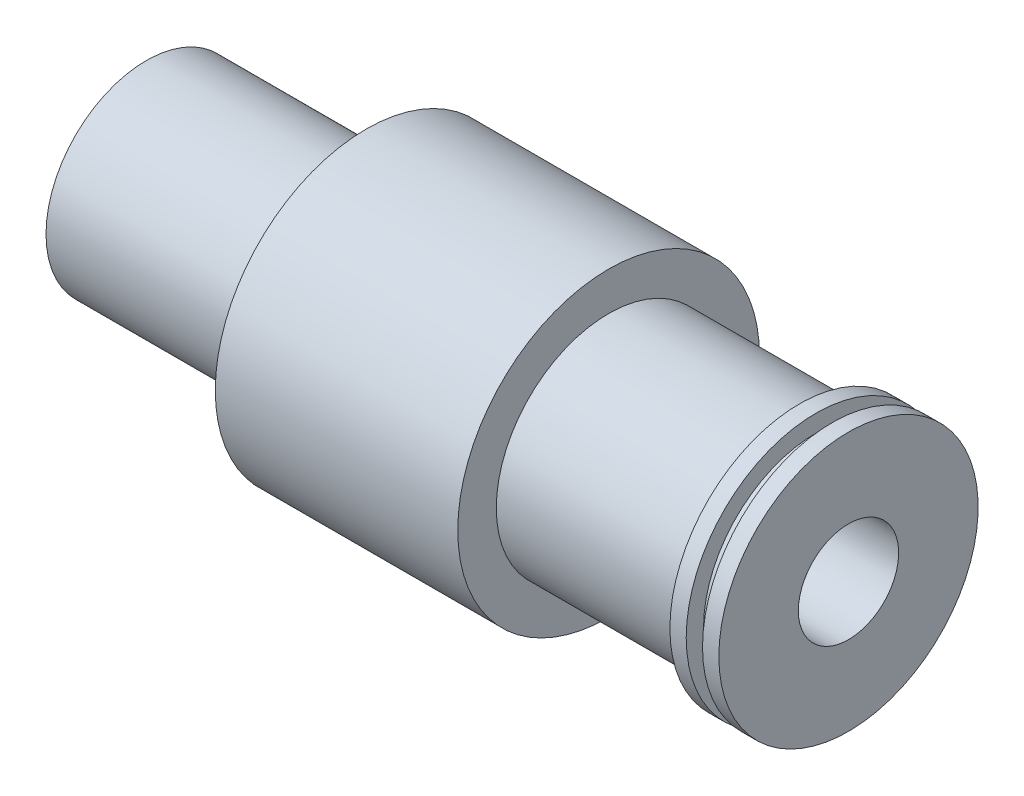
ISO-10303-21;
HEADER;
FILE_DESCRIPTION(('STEP AP214'),'2;1');
FILE_NAME('part.step','',(''),(''),'','','');
FILE_SCHEMA(('AUTOMOTIVE_DESIGN { 1 0 10303 214 1 1 1 1 }'));
ENDSEC;
DATA;
#1=APPLICATION_CONTEXT('core data for automotive mechanical design processes');
#2=APPLICATION_PROTOCOL_DEFINITION('international standard','automotive_design',2000,#1);
#3=PRODUCT_CONTEXT('',#1,'mechanical');
#4=PRODUCT('Part','Part','',(#3));
#5=PRODUCT_RELATED_PRODUCT_CATEGORY('part','',(#4));
#6=PRODUCT_DEFINITION_FORMATION('','',#4);
#7=PRODUCT_DEFINITION_CONTEXT('part definition',#1,'design');
#8=PRODUCT_DEFINITION('design','',#6,#7);
#9=PRODUCT_DEFINITION_SHAPE('','',#8);
#10=(LENGTH_UNIT() NAMED_UNIT(*) SI_UNIT(.MILLI.,.METRE.));
#11=(NAMED_UNIT(*) PLANE_ANGLE_UNIT() SI_UNIT($,.RADIAN.));
#12=(NAMED_UNIT(*) SI_UNIT($,.STERADIAN.) SOLID_ANGLE_UNIT());
#13=UNCERTAINTY_MEASURE_WITH_UNIT(LENGTH_MEASURE(1.E-05),#10,'distance_accuracy_value','');
#14=(GEOMETRIC_REPRESENTATION_CONTEXT(3) GLOBAL_UNCERTAINTY_ASSIGNED_CONTEXT((#13)) GLOBAL_UNIT_ASSIGNED_CONTEXT((#10,
#11,#12)) REPRESENTATION_CONTEXT('',''));
#15=CARTESIAN_POINT('',(0.,0.,0.));
#16=DIRECTION('',(0.,0.,1.));
#17=DIRECTION('',(1.,0.,0.));
#18=AXIS2_PLACEMENT_3D('',#15,#16,#17);
#19=CARTESIAN_POINT('',(-11.1125,0.,0.));
#20=DIRECTION('',(-1.,0.,0.));
#21=DIRECTION('',(0.,0.,1.));
#22=AXIS2_PLACEMENT_3D('',#19,#20,#21);
#23=CYLINDRICAL_SURFACE('',#22,1.5875);
#24=CARTESIAN_POINT('',(11.1125,0.,0.));
#25=DIRECTION('',(-1.,0.,0.));
#26=DIRECTION('',(0.,0.,1.));
#27=AXIS2_PLACEMENT_3D('',#24,#25,#26);
#28=CIRCLE('',#27,1.5875);
#29=CARTESIAN_POINT('',(11.1125,0.,1.5875));
#30=VERTEX_POINT('',#29);
#31=EDGE_CURVE('E79',#30,#30,#28,.T.);
#32=ORIENTED_EDGE('',*,*,#31,.F.);
#33=EDGE_LOOP('',(#32));
#34=FACE_BOUND('',#33,.T.);
#35=CARTESIAN_POINT('',(-11.1125,0.,0.));
#36=DIRECTION('',(-1.,0.,0.));
#37=DIRECTION('',(0.,0.,1.));
#38=AXIS2_PLACEMENT_3D('',#35,#36,#37);
#39=CIRCLE('',#38,1.5875);
#40=CARTESIAN_POINT('',(-11.1125,0.,1.5875));
#41=VERTEX_POINT('',#40);
#42=EDGE_CURVE('E10',#41,#41,#39,.T.);
#43=ORIENTED_EDGE('',*,*,#42,.T.);
#44=EDGE_LOOP('',(#43));
#45=FACE_BOUND('',#44,.T.);
#46=ADVANCED_FACE('F33',(#34,#45),#23,.F.);
#47=CARTESIAN_POINT('',(-11.1125,1.5875,0.));
#48=DIRECTION('',(1.,0.,0.));
#49=DIRECTION('',(0.,0.,-1.));
#50=AXIS2_PLACEMENT_3D('',#47,#48,#49);
#51=PLANE('',#50);
#52=ORIENTED_EDGE('',*,*,#42,.F.);
#53=EDGE_LOOP('',(#52));
#54=FACE_BOUND('',#53,.T.);
#55=CARTESIAN_POINT('',(-11.1125,0.,0.));
#56=DIRECTION('',(-1.,0.,0.));
#57=DIRECTION('',(0.,0.,1.));
#58=AXIS2_PLACEMENT_3D('',#55,#56,#57);
#59=CIRCLE('',#58,3.175);
#60=CARTESIAN_POINT('',(-11.1125,0.,3.175));
#61=VERTEX_POINT('',#60);
#62=EDGE_CURVE('E39',#61,#61,#59,.T.);
#63=ORIENTED_EDGE('',*,*,#62,.T.);
#64=EDGE_LOOP('',(#63));
#65=FACE_BOUND('',#64,.T.);
#66=ADVANCED_FACE('F86',(#54,#65),#51,.F.);
#67=CARTESIAN_POINT('',(-11.1125,0.,0.));
#68=DIRECTION('',(-1.,0.,0.));
#69=DIRECTION('',(0.,0.,1.));
#70=AXIS2_PLACEMENT_3D('',#67,#68,#69);
#71=CYLINDRICAL_SURFACE('',#70,3.175);
#72=ORIENTED_EDGE('',*,*,#62,.F.);
#73=EDGE_LOOP('',(#72));
#74=FACE_BOUND('',#73,.T.);
#75=CARTESIAN_POINT('',(-4.15418279596978,0.,0.));
#76=DIRECTION('',(-1.,0.,0.));
#77=DIRECTION('',(0.,0.,1.));
#78=AXIS2_PLACEMENT_3D('',#75,#76,#77);
#79=CIRCLE('',#78,3.175);
#80=CARTESIAN_POINT('',(-4.15418279596978,0.,3.175));
#81=VERTEX_POINT('',#80);
#82=EDGE_CURVE('E43',#81,#81,#79,.T.);
#83=ORIENTED_EDGE('',*,*,#82,.T.);
#84=EDGE_LOOP('',(#83));
#85=FACE_BOUND('',#84,.T.);
#86=ADVANCED_FACE('F90',(#74,#85),#71,.T.);
#87=CARTESIAN_POINT('',(-4.15418279596978,3.175,0.));
#88=DIRECTION('',(1.,0.,0.));
#89=DIRECTION('',(0.,0.,-1.));
#90=AXIS2_PLACEMENT_3D('',#87,#88,#89);
#91=PLANE('',#90);
#92=ORIENTED_EDGE('',*,*,#82,.F.);
#93=EDGE_LOOP('',(#92));
#94=FACE_BOUND('',#93,.T.);
#95=CARTESIAN_POINT('',(-4.15418279596978,0.,0.));
#96=DIRECTION('',(-1.,0.,0.));
#97=DIRECTION('',(0.,0.,1.));
#98=AXIS2_PLACEMENT_3D('',#95,#96,#97);
#99=CIRCLE('',#98,4.7752);
#100=CARTESIAN_POINT('',(-4.15418279596978,0.,4.7752));
#101=VERTEX_POINT('',#100);
#102=EDGE_CURVE('E47',#101,#101,#99,.T.);
#103=ORIENTED_EDGE('',*,*,#102,.T.);
#104=EDGE_LOOP('',(#103));
#105=FACE_BOUND('',#104,.T.);
#106=ADVANCED_FACE('F95',(#94,#105),#91,.F.);
#107=CARTESIAN_POINT('',(-11.1125,0.,0.));
#108=DIRECTION('',(-1.,0.,0.));
#109=DIRECTION('',(0.,0.,1.));
#110=AXIS2_PLACEMENT_3D('',#107,#108,#109);
#111=CYLINDRICAL_SURFACE('',#110,4.7752);
#112=ORIENTED_EDGE('',*,*,#102,.F.);
#113=EDGE_LOOP('',(#112));
#114=FACE_BOUND('',#113,.T.);
#115=CARTESIAN_POINT('',(3.52050158060453,0.,0.));
#116=DIRECTION('',(-1.,0.,0.));
#117=DIRECTION('',(0.,0.,1.));
#118=AXIS2_PLACEMENT_3D('',#115,#116,#117);
#119=CIRCLE('',#118,4.7752);
#120=CARTESIAN_POINT('',(3.52050158060453,0.,4.7752));
#121=VERTEX_POINT('',#120);
#122=EDGE_CURVE('E52',#121,#121,#119,.T.);
#123=ORIENTED_EDGE('',*,*,#122,.T.);
#124=EDGE_LOOP('',(#123));
#125=FACE_BOUND('',#124,.T.);
#126=ADVANCED_FACE('F101',(#114,#125),#111,.T.);
#127=CARTESIAN_POINT('',(3.52050158060453,4.7752,0.));
#128=DIRECTION('',(-1.,0.,0.));
#129=DIRECTION('',(0.,0.,1.));
#130=AXIS2_PLACEMENT_3D('',#127,#128,#129);
#131=PLANE('',#130);
#132=ORIENTED_EDGE('',*,*,#122,.F.);
#133=EDGE_LOOP('',(#132));
#134=FACE_BOUND('',#133,.T.);
#135=CARTESIAN_POINT('',(3.52050158060453,0.,0.));
#136=DIRECTION('',(-1.,0.,0.));
#137=DIRECTION('',(0.,0.,1.));
#138=AXIS2_PLACEMENT_3D('',#135,#136,#137);
#139=CIRCLE('',#138,3.556);
#140=CARTESIAN_POINT('',(3.52050158060453,0.,3.556));
#141=VERTEX_POINT('',#140);
#142=EDGE_CURVE('E55',#141,#141,#139,.T.);
#143=ORIENTED_EDGE('',*,*,#142,.T.);
#144=EDGE_LOOP('',(#143));
#145=FACE_BOUND('',#144,.T.);
#146=ADVANCED_FACE('F105',(#134,#145),#131,.F.);
#147=CARTESIAN_POINT('',(-11.1125,0.,0.));
#148=DIRECTION('',(-1.,0.,0.));
#149=DIRECTION('',(0.,0.,1.));
#150=AXIS2_PLACEMENT_3D('',#147,#148,#149);
#151=CYLINDRICAL_SURFACE('',#150,3.556);
#152=ORIENTED_EDGE('',*,*,#142,.F.);
#153=EDGE_LOOP('',(#152));
#154=FACE_BOUND('',#153,.T.);
#155=CARTESIAN_POINT('',(9.56351821771582,0.,0.));
#156=DIRECTION('',(-1.,0.,0.));
#157=DIRECTION('',(0.,0.,1.));
#158=AXIS2_PLACEMENT_3D('',#155,#156,#157);
#159=CIRCLE('',#158,3.556);
#160=CARTESIAN_POINT('',(9.56351821771582,0.,3.556));
#161=VERTEX_POINT('',#160);
#162=EDGE_CURVE('E58',#161,#161,#159,.T.);
#163=ORIENTED_EDGE('',*,*,#162,.T.);
#164=EDGE_LOOP('',(#163));
#165=FACE_BOUND('',#164,.T.);
#166=ADVANCED_FACE('F109',(#154,#165),#151,.T.);
#167=CARTESIAN_POINT('',(9.56351821771582,3.556,0.));
#168=DIRECTION('',(1.,0.,0.));
#169=DIRECTION('',(0.,0.,-1.));
#170=AXIS2_PLACEMENT_3D('',#167,#168,#169);
#171=PLANE('',#170);
#172=ORIENTED_EDGE('',*,*,#162,.F.);
#173=EDGE_LOOP('',(#172));
#174=FACE_BOUND('',#173,.T.);
#175=CARTESIAN_POINT('',(9.56351821771582,0.,0.));
#176=DIRECTION('',(-1.,0.,0.));
#177=DIRECTION('',(0.,0.,1.));
#178=AXIS2_PLACEMENT_3D('',#175,#176,#177);
#179=CIRCLE('',#178,4.10410511841802);
#180=CARTESIAN_POINT('',(9.56351821771582,0.,4.10410511841802));
#181=VERTEX_POINT('',#180);
#182=EDGE_CURVE('E61',#181,#181,#179,.T.);
#183=ORIENTED_EDGE('',*,*,#182,.T.);
#184=EDGE_LOOP('',(#183));
#185=FACE_BOUND('',#184,.T.);
#186=ADVANCED_FACE('F113',(#174,#185),#171,.F.);
#187=CARTESIAN_POINT('',(-11.1125,0.,0.));
#188=DIRECTION('',(-1.,0.,0.));
#189=DIRECTION('',(0.,0.,1.));
#190=AXIS2_PLACEMENT_3D('',#187,#188,#189);
#191=CYLINDRICAL_SURFACE('',#190,4.10410511841802);
#192=ORIENTED_EDGE('',*,*,#182,.F.);
#193=EDGE_LOOP('',(#192));
#194=FACE_BOUND('',#193,.T.);
#195=CARTESIAN_POINT('',(10.0798454784772,0.,0.));
#196=DIRECTION('',(-1.,0.,0.));
#197=DIRECTION('',(0.,0.,1.));
#198=AXIS2_PLACEMENT_3D('',#195,#196,#197);
#199=CIRCLE('',#198,4.10410511841802);
#200=CARTESIAN_POINT('',(10.0798454784772,0.,4.10410511841802));
#201=VERTEX_POINT('',#200);
#202=EDGE_CURVE('E64',#201,#201,#199,.T.);
#203=ORIENTED_EDGE('',*,*,#202,.T.);
#204=EDGE_LOOP('',(#203));
#205=FACE_BOUND('',#204,.T.);
#206=ADVANCED_FACE('F117',(#194,#205),#191,.T.);
#207=CARTESIAN_POINT('',(10.0798454784772,4.10410511841802,0.));
#208=DIRECTION('',(-1.,0.,0.));
#209=DIRECTION('',(0.,0.,1.));
#210=AXIS2_PLACEMENT_3D('',#207,#208,#209);
#211=PLANE('',#210);
#212=ORIENTED_EDGE('',*,*,#202,.F.);
#213=EDGE_LOOP('',(#212));
#214=FACE_BOUND('',#213,.T.);
#215=CARTESIAN_POINT('',(10.0798454784772,0.,0.));
#216=DIRECTION('',(-1.,0.,0.));
#217=DIRECTION('',(0.,0.,1.));
#218=AXIS2_PLACEMENT_3D('',#215,#216,#217);
#219=CIRCLE('',#218,3.556);
#220=CARTESIAN_POINT('',(10.0798454784772,0.,3.556));
#221=VERTEX_POINT('',#220);
#222=EDGE_CURVE('E67',#221,#221,#219,.T.);
#223=ORIENTED_EDGE('',*,*,#222,.T.);
#224=EDGE_LOOP('',(#223));
#225=FACE_BOUND('',#224,.T.);
#226=ADVANCED_FACE('F121',(#214,#225),#211,.F.);
#227=CARTESIAN_POINT('',(-11.1125,0.,0.));
#228=DIRECTION('',(-1.,0.,0.));
#229=DIRECTION('',(0.,0.,1.));
#230=AXIS2_PLACEMENT_3D('',#227,#228,#229);
#231=CYLINDRICAL_SURFACE('',#230,3.556);
#232=ORIENTED_EDGE('',*,*,#222,.F.);
#233=EDGE_LOOP('',(#232));
#234=FACE_BOUND('',#233,.T.);
#235=CARTESIAN_POINT('',(10.5961727392386,0.,0.));
#236=DIRECTION('',(-1.,0.,0.));
#237=DIRECTION('',(0.,0.,1.));
#238=AXIS2_PLACEMENT_3D('',#235,#236,#237);
#239=CIRCLE('',#238,3.556);
#240=CARTESIAN_POINT('',(10.5961727392386,0.,3.556));
#241=VERTEX_POINT('',#240);
#242=EDGE_CURVE('E70',#241,#241,#239,.T.);
#243=ORIENTED_EDGE('',*,*,#242,.T.);
#244=EDGE_LOOP('',(#243));
#245=FACE_BOUND('',#244,.T.);
#246=ADVANCED_FACE('F125',(#234,#245),#231,.T.);
#247=CARTESIAN_POINT('',(10.5961727392386,3.556,0.));
#248=DIRECTION('',(1.,0.,0.));
#249=DIRECTION('',(0.,0.,-1.));
#250=AXIS2_PLACEMENT_3D('',#247,#248,#249);
#251=PLANE('',#250);
#252=ORIENTED_EDGE('',*,*,#242,.F.);
#253=EDGE_LOOP('',(#252));
#254=FACE_BOUND('',#253,.T.);
#255=CARTESIAN_POINT('',(10.5961727392386,0.,0.));
#256=DIRECTION('',(-1.,0.,0.));
#257=DIRECTION('',(0.,0.,1.));
#258=AXIS2_PLACEMENT_3D('',#255,#256,#257);
#259=CIRCLE('',#258,4.10410511841802);
#260=CARTESIAN_POINT('',(10.5961727392386,0.,4.10410511841802));
#261=VERTEX_POINT('',#260);
#262=EDGE_CURVE('E73',#261,#261,#259,.T.);
#263=ORIENTED_EDGE('',*,*,#262,.T.);
#264=EDGE_LOOP('',(#263));
#265=FACE_BOUND('',#264,.T.);
#266=ADVANCED_FACE('F129',(#254,#265),#251,.F.);
#267=CARTESIAN_POINT('',(-11.1125,0.,0.));
#268=DIRECTION('',(-1.,0.,0.));
#269=DIRECTION('',(0.,0.,1.));
#270=AXIS2_PLACEMENT_3D('',#267,#268,#269);
#271=CYLINDRICAL_SURFACE('',#270,4.10410511841802);
#272=ORIENTED_EDGE('',*,*,#262,.F.);
#273=EDGE_LOOP('',(#272));
#274=FACE_BOUND('',#273,.T.);
#275=CARTESIAN_POINT('',(11.1125,0.,0.));
#276=DIRECTION('',(-1.,0.,0.));
#277=DIRECTION('',(0.,0.,1.));
#278=AXIS2_PLACEMENT_3D('',#275,#276,#277);
#279=CIRCLE('',#278,4.10410511841802);
#280=CARTESIAN_POINT('',(11.1125,0.,4.10410511841802));
#281=VERTEX_POINT('',#280);
#282=EDGE_CURVE('E76',#281,#281,#279,.T.);
#283=ORIENTED_EDGE('',*,*,#282,.T.);
#284=EDGE_LOOP('',(#283));
#285=FACE_BOUND('',#284,.T.);
#286=ADVANCED_FACE('F133',(#274,#285),#271,.T.);
#287=CARTESIAN_POINT('',(11.1125,4.10410511841802,0.));
#288=DIRECTION('',(-1.,0.,0.));
#289=DIRECTION('',(0.,0.,1.));
#290=AXIS2_PLACEMENT_3D('',#287,#288,#289);
#291=PLANE('',#290);
#292=ORIENTED_EDGE('',*,*,#282,.F.);
#293=EDGE_LOOP('',(#292));
#294=FACE_BOUND('',#293,.T.);
#295=ORIENTED_EDGE('',*,*,#31,.T.);
#296=EDGE_LOOP('',(#295));
#297=FACE_BOUND('',#296,.T.);
#298=ADVANCED_FACE('F83',(#294,#297),#291,.F.);
#299=CLOSED_SHELL('',(#46,#66,#86,#106,#126,#146,#166,#186,#206,#226,#246,#266,#286,#298));
#300=MANIFOLD_SOLID_BREP('B2',#299);
#301=ADVANCED_BREP_SHAPE_REPRESENTATION('',(#18,#300),#14);
#302=SHAPE_DEFINITION_REPRESENTATION(#9,#301);
ENDSEC;
END-ISO-10303-21;
